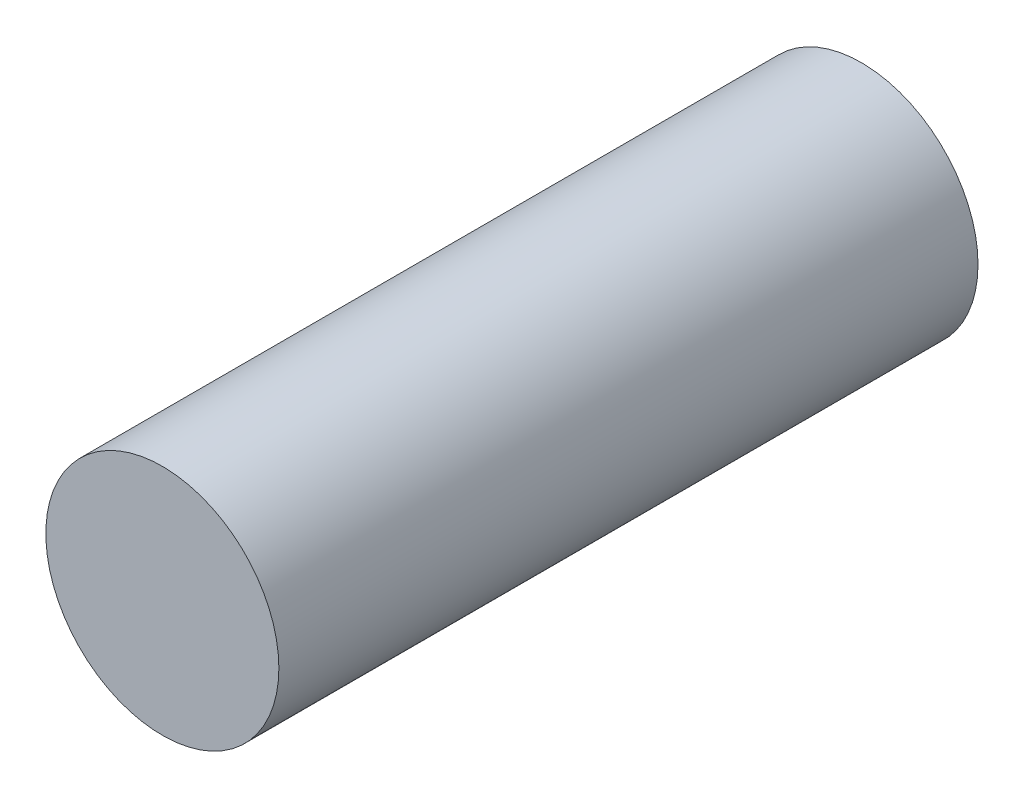
ISO-10303-21;
HEADER;
FILE_DESCRIPTION(('STEP AP214'),'2;1');
FILE_NAME('part.step','',(''),(''),'','','');
FILE_SCHEMA(('AUTOMOTIVE_DESIGN { 1 0 10303 214 1 1 1 1 }'));
ENDSEC;
DATA;
#1=APPLICATION_CONTEXT('core data for automotive mechanical design processes');
#2=APPLICATION_PROTOCOL_DEFINITION('international standard','automotive_design',2000,#1);
#3=PRODUCT_CONTEXT('',#1,'mechanical');
#4=PRODUCT('Part','Part','',(#3));
#5=PRODUCT_RELATED_PRODUCT_CATEGORY('part','',(#4));
#6=PRODUCT_DEFINITION_FORMATION('','',#4);
#7=PRODUCT_DEFINITION_CONTEXT('part definition',#1,'design');
#8=PRODUCT_DEFINITION('design','',#6,#7);
#9=PRODUCT_DEFINITION_SHAPE('','',#8);
#10=(LENGTH_UNIT() NAMED_UNIT(*) SI_UNIT(.MILLI.,.METRE.));
#11=(NAMED_UNIT(*) PLANE_ANGLE_UNIT() SI_UNIT($,.RADIAN.));
#12=(NAMED_UNIT(*) SI_UNIT($,.STERADIAN.) SOLID_ANGLE_UNIT());
#13=UNCERTAINTY_MEASURE_WITH_UNIT(LENGTH_MEASURE(1.E-05),#10,'distance_accuracy_value','');
#14=(GEOMETRIC_REPRESENTATION_CONTEXT(3) GLOBAL_UNCERTAINTY_ASSIGNED_CONTEXT((#13)) GLOBAL_UNIT_ASSIGNED_CONTEXT((#10,
#11,#12)) REPRESENTATION_CONTEXT('',''));
#15=CARTESIAN_POINT('',(0.,0.,0.));
#16=DIRECTION('',(0.,0.,1.));
#17=DIRECTION('',(1.,0.,0.));
#18=AXIS2_PLACEMENT_3D('',#15,#16,#17);
#19=CARTESIAN_POINT('',(0.,0.,30.));
#20=DIRECTION('',(0.,0.,-1.));
#21=DIRECTION('',(-1.,0.,0.));
#22=AXIS2_PLACEMENT_3D('',#19,#20,#21);
#23=CYLINDRICAL_SURFACE('',#22,5.);
#24=CARTESIAN_POINT('',(0.,0.,30.));
#25=DIRECTION('',(0.,0.,1.));
#26=DIRECTION('',(1.,0.,0.));
#27=AXIS2_PLACEMENT_3D('',#24,#25,#26);
#28=CIRCLE('',#27,5.);
#29=CARTESIAN_POINT('',(5.,0.,30.));
#30=VERTEX_POINT('',#29);
#31=EDGE_CURVE('E10',#30,#30,#28,.T.);
#32=ORIENTED_EDGE('',*,*,#31,.F.);
#33=EDGE_LOOP('',(#32));
#34=FACE_BOUND('',#33,.T.);
#35=CARTESIAN_POINT('',(0.,0.,0.));
#36=DIRECTION('',(0.,0.,1.));
#37=DIRECTION('',(1.,0.,0.));
#38=AXIS2_PLACEMENT_3D('',#35,#36,#37);
#39=CIRCLE('',#38,5.);
#40=CARTESIAN_POINT('',(5.,0.,0.));
#41=VERTEX_POINT('',#40);
#42=EDGE_CURVE('E33',#41,#41,#39,.T.);
#43=ORIENTED_EDGE('',*,*,#42,.T.);
#44=EDGE_LOOP('',(#43));
#45=FACE_BOUND('',#44,.T.);
#46=ADVANCED_FACE('F30',(#34,#45),#23,.T.);
#47=CARTESIAN_POINT('',(0.,0.,30.));
#48=DIRECTION('',(0.,0.,1.));
#49=DIRECTION('',(1.,0.,0.));
#50=AXIS2_PLACEMENT_3D('',#47,#48,#49);
#51=PLANE('',#50);
#52=ORIENTED_EDGE('',*,*,#31,.T.);
#53=EDGE_LOOP('',(#52));
#54=FACE_BOUND('',#53,.T.);
#55=ADVANCED_FACE('F45',(#54),#51,.T.);
#56=CARTESIAN_POINT('',(0.,0.,0.));
#57=DIRECTION('',(0.,0.,1.));
#58=DIRECTION('',(1.,0.,0.));
#59=AXIS2_PLACEMENT_3D('',#56,#57,#58);
#60=PLANE('',#59);
#61=ORIENTED_EDGE('',*,*,#42,.F.);
#62=EDGE_LOOP('',(#61));
#63=FACE_BOUND('',#62,.T.);
#64=ADVANCED_FACE('F43',(#63),#60,.F.);
#65=CLOSED_SHELL('',(#46,#55,#64));
#66=MANIFOLD_SOLID_BREP('B2',#65);
#67=ADVANCED_BREP_SHAPE_REPRESENTATION('',(#18,#66),#14);
#68=SHAPE_DEFINITION_REPRESENTATION(#9,#67);
ENDSEC;
END-ISO-10303-21;
